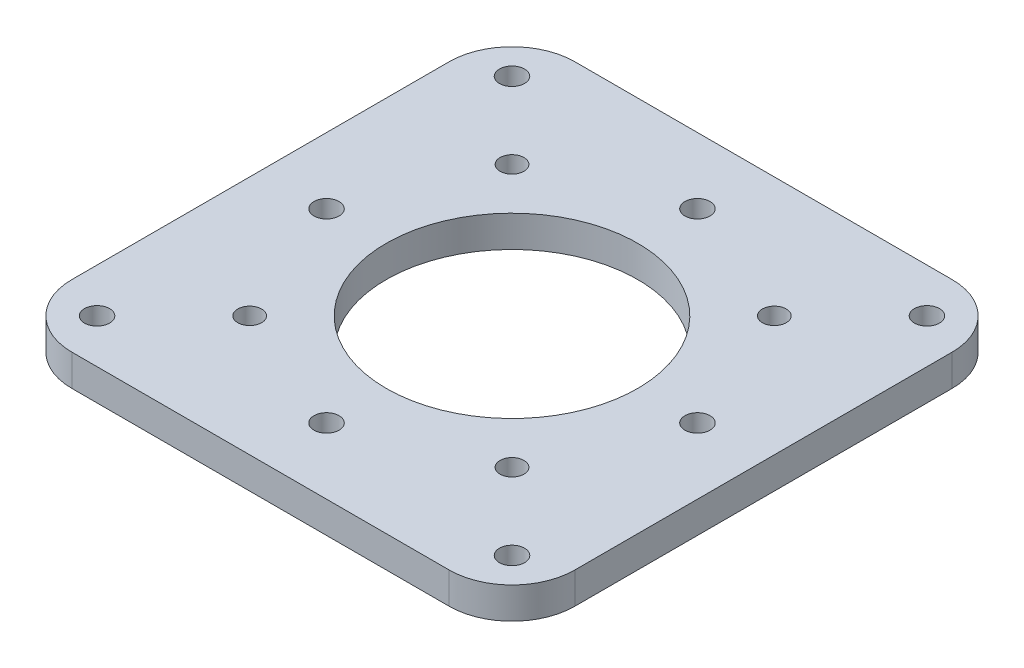
ISO-10303-21;
HEADER;
FILE_DESCRIPTION(('STEP AP214'),'2;1');
FILE_NAME('part.step','',(''),(''),'','','');
FILE_SCHEMA(('AUTOMOTIVE_DESIGN { 1 0 10303 214 1 1 1 1 }'));
ENDSEC;
DATA;
#1=APPLICATION_CONTEXT('core data for automotive mechanical design processes');
#2=APPLICATION_PROTOCOL_DEFINITION('international standard','automotive_design',2000,#1);
#3=PRODUCT_CONTEXT('',#1,'mechanical');
#4=PRODUCT('Part','Part','',(#3));
#5=PRODUCT_RELATED_PRODUCT_CATEGORY('part','',(#4));
#6=PRODUCT_DEFINITION_FORMATION('','',#4);
#7=PRODUCT_DEFINITION_CONTEXT('part definition',#1,'design');
#8=PRODUCT_DEFINITION('design','',#6,#7);
#9=PRODUCT_DEFINITION_SHAPE('','',#8);
#10=(LENGTH_UNIT() NAMED_UNIT(*) SI_UNIT(.MILLI.,.METRE.));
#11=(NAMED_UNIT(*) PLANE_ANGLE_UNIT() SI_UNIT($,.RADIAN.));
#12=(NAMED_UNIT(*) SI_UNIT($,.STERADIAN.) SOLID_ANGLE_UNIT());
#13=UNCERTAINTY_MEASURE_WITH_UNIT(LENGTH_MEASURE(1.E-05),#10,'distance_accuracy_value','');
#14=(GEOMETRIC_REPRESENTATION_CONTEXT(3) GLOBAL_UNCERTAINTY_ASSIGNED_CONTEXT((#13)) GLOBAL_UNIT_ASSIGNED_CONTEXT((#10,
#11,#12)) REPRESENTATION_CONTEXT('',''));
#15=CARTESIAN_POINT('',(0.,0.,0.));
#16=DIRECTION('',(0.,0.,1.));
#17=DIRECTION('',(1.,0.,0.));
#18=AXIS2_PLACEMENT_3D('',#15,#16,#17);
#19=CARTESIAN_POINT('',(0.,5.,0.));
#20=DIRECTION('',(0.,-1.,0.));
#21=DIRECTION('',(0.,0.,-1.));
#22=AXIS2_PLACEMENT_3D('',#19,#20,#21);
#23=PLANE('',#22);
#24=DIRECTION('',(-1.,0.,0.));
#25=VECTOR('',#24,1.);
#26=CARTESIAN_POINT('',(-40.,5.,-40.));
#27=LINE('',#26,#25);
#28=CARTESIAN_POINT('',(30.,5.,-40.));
#29=VERTEX_POINT('',#28);
#30=CARTESIAN_POINT('',(-30.,5.,-40.));
#31=VERTEX_POINT('',#30);
#32=EDGE_CURVE('E171',#29,#31,#27,.T.);
#33=ORIENTED_EDGE('',*,*,#32,.T.);
#34=CARTESIAN_POINT('',(-30.,5.,-30.));
#35=DIRECTION('',(0.,-1.,0.));
#36=DIRECTION('',(0.,0.,-1.));
#37=AXIS2_PLACEMENT_3D('',#34,#35,#36);
#38=CIRCLE('',#37,10.);
#39=CARTESIAN_POINT('',(-40.,5.,-30.));
#40=VERTEX_POINT('',#39);
#41=EDGE_CURVE('E151',#31,#40,#38,.F.);
#42=ORIENTED_EDGE('',*,*,#41,.T.);
#43=DIRECTION('',(0.,0.,1.));
#44=VECTOR('',#43,1.);
#45=CARTESIAN_POINT('',(-40.,5.,40.));
#46=LINE('',#45,#44);
#47=CARTESIAN_POINT('',(-40.,5.,30.));
#48=VERTEX_POINT('',#47);
#49=EDGE_CURVE('E121',#40,#48,#46,.T.);
#50=ORIENTED_EDGE('',*,*,#49,.T.);
#51=CARTESIAN_POINT('',(-30.,5.,30.));
#52=DIRECTION('',(0.,-1.,0.));
#53=DIRECTION('',(0.,0.,-1.));
#54=AXIS2_PLACEMENT_3D('',#51,#52,#53);
#55=CIRCLE('',#54,10.);
#56=CARTESIAN_POINT('',(-30.,5.,40.));
#57=VERTEX_POINT('',#56);
#58=EDGE_CURVE('E57',#48,#57,#55,.F.);
#59=ORIENTED_EDGE('',*,*,#58,.T.);
#60=DIRECTION('',(1.,0.,0.));
#61=VECTOR('',#60,1.);
#62=CARTESIAN_POINT('',(-40.,5.,40.));
#63=LINE('',#62,#61);
#64=CARTESIAN_POINT('',(30.,5.,40.));
#65=VERTEX_POINT('',#64);
#66=EDGE_CURVE('E138',#57,#65,#63,.T.);
#67=ORIENTED_EDGE('',*,*,#66,.T.);
#68=CARTESIAN_POINT('',(30.,5.,30.));
#69=DIRECTION('',(0.,-1.,0.));
#70=DIRECTION('',(0.,0.,-1.));
#71=AXIS2_PLACEMENT_3D('',#68,#69,#70);
#72=CIRCLE('',#71,10.);
#73=CARTESIAN_POINT('',(40.,5.,30.));
#74=VERTEX_POINT('',#73);
#75=EDGE_CURVE('E146',#65,#74,#72,.F.);
#76=ORIENTED_EDGE('',*,*,#75,.T.);
#77=DIRECTION('',(0.,0.,-1.));
#78=VECTOR('',#77,1.);
#79=CARTESIAN_POINT('',(40.,5.,40.));
#80=LINE('',#79,#78);
#81=CARTESIAN_POINT('',(40.,5.,-30.));
#82=VERTEX_POINT('',#81);
#83=EDGE_CURVE('E132',#74,#82,#80,.T.);
#84=ORIENTED_EDGE('',*,*,#83,.T.);
#85=CARTESIAN_POINT('',(30.,5.,-30.));
#86=DIRECTION('',(0.,-1.,0.));
#87=DIRECTION('',(0.,0.,-1.));
#88=AXIS2_PLACEMENT_3D('',#85,#86,#87);
#89=CIRCLE('',#88,10.);
#90=EDGE_CURVE('E149',#82,#29,#89,.F.);
#91=ORIENTED_EDGE('',*,*,#90,.T.);
#92=EDGE_LOOP('',(#33,#42,#50,#59,#67,#76,#84,#91));
#93=FACE_BOUND('',#92,.T.);
#94=CARTESIAN_POINT('',(20.859650045003,5.,-20.8596500450033));
#95=DIRECTION('',(0.,1.,0.));
#96=DIRECTION('',(0.,0.,1.));
#97=AXIS2_PLACEMENT_3D('',#94,#95,#96);
#98=CIRCLE('',#97,1.90000000000001);
#99=CARTESIAN_POINT('',(20.859650045003,5.,-18.9596500450033));
#100=VERTEX_POINT('',#99);
#101=EDGE_CURVE('E177',#100,#100,#98,.T.);
#102=ORIENTED_EDGE('',*,*,#101,.F.);
#103=EDGE_LOOP('',(#102));
#104=FACE_BOUND('',#103,.T.);
#105=CARTESIAN_POINT('',(20.8596500450044,5.,20.859650045003));
#106=DIRECTION('',(0.,1.,0.));
#107=DIRECTION('',(0.,0.,1.));
#108=AXIS2_PLACEMENT_3D('',#105,#106,#107);
#109=CIRCLE('',#108,1.9);
#110=CARTESIAN_POINT('',(20.8596500450044,5.,22.759650045003));
#111=VERTEX_POINT('',#110);
#112=EDGE_CURVE('E186',#111,#111,#109,.T.);
#113=ORIENTED_EDGE('',*,*,#112,.F.);
#114=EDGE_LOOP('',(#113));
#115=FACE_BOUND('',#114,.T.);
#116=CARTESIAN_POINT('',(-20.8596500450019,5.,20.8596500450044));
#117=DIRECTION('',(0.,1.,0.));
#118=DIRECTION('',(0.,0.,1.));
#119=AXIS2_PLACEMENT_3D('',#116,#117,#118);
#120=CIRCLE('',#119,1.9);
#121=CARTESIAN_POINT('',(-20.8596500450019,5.,22.7596500450044));
#122=VERTEX_POINT('',#121);
#123=EDGE_CURVE('E191',#122,#122,#120,.T.);
#124=ORIENTED_EDGE('',*,*,#123,.F.);
#125=EDGE_LOOP('',(#124));
#126=FACE_BOUND('',#125,.T.);
#127=CARTESIAN_POINT('',(-20.8596500450033,5.,-20.8596500450019));
#128=DIRECTION('',(0.,1.,0.));
#129=DIRECTION('',(0.,0.,1.));
#130=AXIS2_PLACEMENT_3D('',#127,#128,#129);
#131=CIRCLE('',#130,1.9);
#132=CARTESIAN_POINT('',(-20.8596500450033,5.,-18.9596500450019));
#133=VERTEX_POINT('',#132);
#134=EDGE_CURVE('E197',#133,#133,#131,.T.);
#135=ORIENTED_EDGE('',*,*,#134,.F.);
#136=EDGE_LOOP('',(#135));
#137=FACE_BOUND('',#136,.T.);
#138=CARTESIAN_POINT('',(-33.,5.,-33.));
#139=DIRECTION('',(0.,1.,0.));
#140=DIRECTION('',(0.,0.,1.));
#141=AXIS2_PLACEMENT_3D('',#138,#139,#140);
#142=CIRCLE('',#141,2.);
#143=CARTESIAN_POINT('',(-33.,5.,-31.));
#144=VERTEX_POINT('',#143);
#145=EDGE_CURVE('E203',#144,#144,#142,.T.);
#146=ORIENTED_EDGE('',*,*,#145,.F.);
#147=EDGE_LOOP('',(#146));
#148=FACE_BOUND('',#147,.T.);
#149=CARTESIAN_POINT('',(33.,5.,-33.));
#150=DIRECTION('',(0.,1.,0.));
#151=DIRECTION('',(0.,0.,1.));
#152=AXIS2_PLACEMENT_3D('',#149,#150,#151);
#153=CIRCLE('',#152,2.);
#154=CARTESIAN_POINT('',(33.,5.,-31.));
#155=VERTEX_POINT('',#154);
#156=EDGE_CURVE('E209',#155,#155,#153,.T.);
#157=ORIENTED_EDGE('',*,*,#156,.F.);
#158=EDGE_LOOP('',(#157));
#159=FACE_BOUND('',#158,.T.);
#160=CARTESIAN_POINT('',(33.,5.,33.));
#161=DIRECTION('',(0.,1.,0.));
#162=DIRECTION('',(0.,0.,1.));
#163=AXIS2_PLACEMENT_3D('',#160,#161,#162);
#164=CIRCLE('',#163,2.);
#165=CARTESIAN_POINT('',(33.,5.,35.));
#166=VERTEX_POINT('',#165);
#167=EDGE_CURVE('E215',#166,#166,#164,.T.);
#168=ORIENTED_EDGE('',*,*,#167,.F.);
#169=EDGE_LOOP('',(#168));
#170=FACE_BOUND('',#169,.T.);
#171=CARTESIAN_POINT('',(-33.,5.,33.));
#172=DIRECTION('',(0.,1.,0.));
#173=DIRECTION('',(0.,0.,1.));
#174=AXIS2_PLACEMENT_3D('',#171,#172,#173);
#175=CIRCLE('',#174,2.);
#176=CARTESIAN_POINT('',(-33.,5.,35.));
#177=VERTEX_POINT('',#176);
#178=EDGE_CURVE('E221',#177,#177,#175,.T.);
#179=ORIENTED_EDGE('',*,*,#178,.F.);
#180=EDGE_LOOP('',(#179));
#181=FACE_BOUND('',#180,.T.);
#182=CARTESIAN_POINT('',(0.,5.,0.));
#183=DIRECTION('',(0.,1.,0.));
#184=DIRECTION('',(0.,0.,1.));
#185=AXIS2_PLACEMENT_3D('',#182,#183,#184);
#186=CIRCLE('',#185,20.);
#187=CARTESIAN_POINT('',(0.,5.,20.));
#188=VERTEX_POINT('',#187);
#189=EDGE_CURVE('E227',#188,#188,#186,.T.);
#190=ORIENTED_EDGE('',*,*,#189,.F.);
#191=EDGE_LOOP('',(#190));
#192=FACE_BOUND('',#191,.T.);
#193=CARTESIAN_POINT('',(0.,5.,-29.5));
#194=DIRECTION('',(0.,1.,0.));
#195=DIRECTION('',(0.,0.,1.));
#196=AXIS2_PLACEMENT_3D('',#193,#194,#195);
#197=CIRCLE('',#196,2.);
#198=CARTESIAN_POINT('',(0.,5.,-27.5));
#199=VERTEX_POINT('',#198);
#200=EDGE_CURVE('E233',#199,#199,#197,.T.);
#201=ORIENTED_EDGE('',*,*,#200,.F.);
#202=EDGE_LOOP('',(#201));
#203=FACE_BOUND('',#202,.T.);
#204=CARTESIAN_POINT('',(29.5000000000008,5.,-8.38674380875494E-13));
#205=DIRECTION('',(0.,1.,0.));
#206=DIRECTION('',(0.,0.,1.));
#207=AXIS2_PLACEMENT_3D('',#204,#205,#206);
#208=CIRCLE('',#207,2.00000000000067);
#209=CARTESIAN_POINT('',(29.5000000000008,5.,1.99999999999983));
#210=VERTEX_POINT('',#209);
#211=EDGE_CURVE('E239',#210,#210,#208,.T.);
#212=ORIENTED_EDGE('',*,*,#211,.F.);
#213=EDGE_LOOP('',(#212));
#214=FACE_BOUND('',#213,.T.);
#215=CARTESIAN_POINT('',(1.67863464089009E-12,5.,29.5));
#216=DIRECTION('',(0.,1.,0.));
#217=DIRECTION('',(0.,0.,1.));
#218=AXIS2_PLACEMENT_3D('',#215,#216,#217);
#219=CIRCLE('',#218,2.00000000000181);
#220=CARTESIAN_POINT('',(1.67863464089009E-12,5.,31.5000000000018));
#221=VERTEX_POINT('',#220);
#222=EDGE_CURVE('E245',#221,#221,#219,.T.);
#223=ORIENTED_EDGE('',*,*,#222,.F.);
#224=EDGE_LOOP('',(#223));
#225=FACE_BOUND('',#224,.T.);
#226=CARTESIAN_POINT('',(-29.4999999999992,5.,8.42287088932979E-13));
#227=DIRECTION('',(0.,1.,0.));
#228=DIRECTION('',(0.,0.,1.));
#229=AXIS2_PLACEMENT_3D('',#226,#227,#228);
#230=CIRCLE('',#229,2.00000000000136);
#231=CARTESIAN_POINT('',(-29.4999999999992,5.,2.0000000000022));
#232=VERTEX_POINT('',#231);
#233=EDGE_CURVE('E251',#232,#232,#230,.T.);
#234=ORIENTED_EDGE('',*,*,#233,.F.);
#235=EDGE_LOOP('',(#234));
#236=FACE_BOUND('',#235,.T.);
#237=ADVANCED_FACE('F36',(#93,#104,#115,#126,#137,#148,#159,#170,#181,#192,#203,#214,#225,#236),
#23,.F.);
#238=CARTESIAN_POINT('',(0.,0.,0.));
#239=DIRECTION('',(0.,-1.,0.));
#240=DIRECTION('',(0.,0.,-1.));
#241=AXIS2_PLACEMENT_3D('',#238,#239,#240);
#242=PLANE('',#241);
#243=CARTESIAN_POINT('',(1.67863464089009E-12,0.,29.5));
#244=DIRECTION('',(0.,1.,0.));
#245=DIRECTION('',(0.,0.,1.));
#246=AXIS2_PLACEMENT_3D('',#243,#244,#245);
#247=CIRCLE('',#246,2.00000000000181);
#248=CARTESIAN_POINT('',(1.67863464089009E-12,0.,31.5000000000018));
#249=VERTEX_POINT('',#248);
#250=EDGE_CURVE('E248',#249,#249,#247,.T.);
#251=ORIENTED_EDGE('',*,*,#250,.T.);
#252=EDGE_LOOP('',(#251));
#253=FACE_BOUND('',#252,.T.);
#254=CARTESIAN_POINT('',(0.,0.,-29.5));
#255=DIRECTION('',(0.,1.,0.));
#256=DIRECTION('',(0.,0.,1.));
#257=AXIS2_PLACEMENT_3D('',#254,#255,#256);
#258=CIRCLE('',#257,2.);
#259=CARTESIAN_POINT('',(0.,0.,-27.5));
#260=VERTEX_POINT('',#259);
#261=EDGE_CURVE('E236',#260,#260,#258,.T.);
#262=ORIENTED_EDGE('',*,*,#261,.T.);
#263=EDGE_LOOP('',(#262));
#264=FACE_BOUND('',#263,.T.);
#265=CARTESIAN_POINT('',(-33.,0.,33.));
#266=DIRECTION('',(0.,1.,0.));
#267=DIRECTION('',(0.,0.,1.));
#268=AXIS2_PLACEMENT_3D('',#265,#266,#267);
#269=CIRCLE('',#268,2.);
#270=CARTESIAN_POINT('',(-33.,0.,35.));
#271=VERTEX_POINT('',#270);
#272=EDGE_CURVE('E224',#271,#271,#269,.T.);
#273=ORIENTED_EDGE('',*,*,#272,.T.);
#274=EDGE_LOOP('',(#273));
#275=FACE_BOUND('',#274,.T.);
#276=CARTESIAN_POINT('',(33.,0.,-33.));
#277=DIRECTION('',(0.,1.,0.));
#278=DIRECTION('',(0.,0.,1.));
#279=AXIS2_PLACEMENT_3D('',#276,#277,#278);
#280=CIRCLE('',#279,2.);
#281=CARTESIAN_POINT('',(33.,0.,-31.));
#282=VERTEX_POINT('',#281);
#283=EDGE_CURVE('E212',#282,#282,#280,.T.);
#284=ORIENTED_EDGE('',*,*,#283,.T.);
#285=EDGE_LOOP('',(#284));
#286=FACE_BOUND('',#285,.T.);
#287=CARTESIAN_POINT('',(-20.8596500450033,0.,-20.8596500450019));
#288=DIRECTION('',(0.,1.,0.));
#289=DIRECTION('',(0.,0.,1.));
#290=AXIS2_PLACEMENT_3D('',#287,#288,#289);
#291=CIRCLE('',#290,1.9);
#292=CARTESIAN_POINT('',(-20.8596500450033,0.,-18.9596500450019));
#293=VERTEX_POINT('',#292);
#294=EDGE_CURVE('E200',#293,#293,#291,.T.);
#295=ORIENTED_EDGE('',*,*,#294,.T.);
#296=EDGE_LOOP('',(#295));
#297=FACE_BOUND('',#296,.T.);
#298=CARTESIAN_POINT('',(20.8596500450044,0.,20.859650045003));
#299=DIRECTION('',(0.,1.,0.));
#300=DIRECTION('',(0.,0.,1.));
#301=AXIS2_PLACEMENT_3D('',#298,#299,#300);
#302=CIRCLE('',#301,1.9);
#303=CARTESIAN_POINT('',(20.8596500450044,0.,22.759650045003));
#304=VERTEX_POINT('',#303);
#305=EDGE_CURVE('E188',#304,#304,#302,.T.);
#306=ORIENTED_EDGE('',*,*,#305,.T.);
#307=EDGE_LOOP('',(#306));
#308=FACE_BOUND('',#307,.T.);
#309=DIRECTION('',(0.,0.,1.));
#310=VECTOR('',#309,1.);
#311=CARTESIAN_POINT('',(-40.,0.,40.));
#312=LINE('',#311,#310);
#313=CARTESIAN_POINT('',(-40.,0.,-30.));
#314=VERTEX_POINT('',#313);
#315=CARTESIAN_POINT('',(-40.,0.,30.));
#316=VERTEX_POINT('',#315);
#317=EDGE_CURVE('E119',#314,#316,#312,.T.);
#318=ORIENTED_EDGE('',*,*,#317,.F.);
#319=CARTESIAN_POINT('',(-30.,0.,-30.));
#320=DIRECTION('',(0.,-1.,0.));
#321=DIRECTION('',(0.,0.,-1.));
#322=AXIS2_PLACEMENT_3D('',#319,#320,#321);
#323=CIRCLE('',#322,10.);
#324=CARTESIAN_POINT('',(-30.,0.,-40.));
#325=VERTEX_POINT('',#324);
#326=EDGE_CURVE('E102',#314,#325,#323,.T.);
#327=ORIENTED_EDGE('',*,*,#326,.T.);
#328=DIRECTION('',(-1.,0.,0.));
#329=VECTOR('',#328,1.);
#330=CARTESIAN_POINT('',(-40.,0.,-40.));
#331=LINE('',#330,#329);
#332=CARTESIAN_POINT('',(30.,0.,-40.));
#333=VERTEX_POINT('',#332);
#334=EDGE_CURVE('E130',#333,#325,#331,.T.);
#335=ORIENTED_EDGE('',*,*,#334,.F.);
#336=CARTESIAN_POINT('',(30.,0.,-30.));
#337=DIRECTION('',(0.,-1.,0.));
#338=DIRECTION('',(0.,0.,-1.));
#339=AXIS2_PLACEMENT_3D('',#336,#337,#338);
#340=CIRCLE('',#339,10.);
#341=CARTESIAN_POINT('',(40.,0.,-30.));
#342=VERTEX_POINT('',#341);
#343=EDGE_CURVE('E113',#333,#342,#340,.T.);
#344=ORIENTED_EDGE('',*,*,#343,.T.);
#345=DIRECTION('',(0.,0.,-1.));
#346=VECTOR('',#345,1.);
#347=CARTESIAN_POINT('',(40.,0.,40.));
#348=LINE('',#347,#346);
#349=CARTESIAN_POINT('',(40.,0.,30.));
#350=VERTEX_POINT('',#349);
#351=EDGE_CURVE('E134',#350,#342,#348,.T.);
#352=ORIENTED_EDGE('',*,*,#351,.F.);
#353=CARTESIAN_POINT('',(30.,0.,30.));
#354=DIRECTION('',(0.,-1.,0.));
#355=DIRECTION('',(0.,0.,-1.));
#356=AXIS2_PLACEMENT_3D('',#353,#354,#355);
#357=CIRCLE('',#356,10.);
#358=CARTESIAN_POINT('',(30.,0.,40.));
#359=VERTEX_POINT('',#358);
#360=EDGE_CURVE('E122',#350,#359,#357,.T.);
#361=ORIENTED_EDGE('',*,*,#360,.T.);
#362=DIRECTION('',(1.,0.,0.));
#363=VECTOR('',#362,1.);
#364=CARTESIAN_POINT('',(-40.,0.,40.));
#365=LINE('',#364,#363);
#366=CARTESIAN_POINT('',(-30.,0.,40.));
#367=VERTEX_POINT('',#366);
#368=EDGE_CURVE('E129',#367,#359,#365,.T.);
#369=ORIENTED_EDGE('',*,*,#368,.F.);
#370=CARTESIAN_POINT('',(-30.,0.,30.));
#371=DIRECTION('',(0.,-1.,0.));
#372=DIRECTION('',(0.,0.,-1.));
#373=AXIS2_PLACEMENT_3D('',#370,#371,#372);
#374=CIRCLE('',#373,10.);
#375=EDGE_CURVE('E128',#367,#316,#374,.T.);
#376=ORIENTED_EDGE('',*,*,#375,.T.);
#377=EDGE_LOOP('',(#318,#327,#335,#344,#352,#361,#369,#376));
#378=FACE_BOUND('',#377,.T.);
#379=CARTESIAN_POINT('',(20.859650045003,0.,-20.8596500450033));
#380=DIRECTION('',(0.,1.,0.));
#381=DIRECTION('',(0.,0.,1.));
#382=AXIS2_PLACEMENT_3D('',#379,#380,#381);
#383=CIRCLE('',#382,1.90000000000001);
#384=CARTESIAN_POINT('',(20.859650045003,0.,-18.9596500450033));
#385=VERTEX_POINT('',#384);
#386=EDGE_CURVE('E179',#385,#385,#383,.T.);
#387=ORIENTED_EDGE('',*,*,#386,.T.);
#388=EDGE_LOOP('',(#387));
#389=FACE_BOUND('',#388,.T.);
#390=CARTESIAN_POINT('',(-20.8596500450019,0.,20.8596500450044));
#391=DIRECTION('',(0.,1.,0.));
#392=DIRECTION('',(0.,0.,1.));
#393=AXIS2_PLACEMENT_3D('',#390,#391,#392);
#394=CIRCLE('',#393,1.9);
#395=CARTESIAN_POINT('',(-20.8596500450019,0.,22.7596500450044));
#396=VERTEX_POINT('',#395);
#397=EDGE_CURVE('E194',#396,#396,#394,.T.);
#398=ORIENTED_EDGE('',*,*,#397,.T.);
#399=EDGE_LOOP('',(#398));
#400=FACE_BOUND('',#399,.T.);
#401=CARTESIAN_POINT('',(-33.,0.,-33.));
#402=DIRECTION('',(0.,1.,0.));
#403=DIRECTION('',(0.,0.,1.));
#404=AXIS2_PLACEMENT_3D('',#401,#402,#403);
#405=CIRCLE('',#404,2.);
#406=CARTESIAN_POINT('',(-33.,0.,-31.));
#407=VERTEX_POINT('',#406);
#408=EDGE_CURVE('E206',#407,#407,#405,.T.);
#409=ORIENTED_EDGE('',*,*,#408,.T.);
#410=EDGE_LOOP('',(#409));
#411=FACE_BOUND('',#410,.T.);
#412=CARTESIAN_POINT('',(33.,0.,33.));
#413=DIRECTION('',(0.,1.,0.));
#414=DIRECTION('',(0.,0.,1.));
#415=AXIS2_PLACEMENT_3D('',#412,#413,#414);
#416=CIRCLE('',#415,2.);
#417=CARTESIAN_POINT('',(33.,0.,35.));
#418=VERTEX_POINT('',#417);
#419=EDGE_CURVE('E218',#418,#418,#416,.T.);
#420=ORIENTED_EDGE('',*,*,#419,.T.);
#421=EDGE_LOOP('',(#420));
#422=FACE_BOUND('',#421,.T.);
#423=CARTESIAN_POINT('',(0.,0.,0.));
#424=DIRECTION('',(0.,1.,0.));
#425=DIRECTION('',(0.,0.,1.));
#426=AXIS2_PLACEMENT_3D('',#423,#424,#425);
#427=CIRCLE('',#426,20.);
#428=CARTESIAN_POINT('',(0.,0.,20.));
#429=VERTEX_POINT('',#428);
#430=EDGE_CURVE('E230',#429,#429,#427,.T.);
#431=ORIENTED_EDGE('',*,*,#430,.T.);
#432=EDGE_LOOP('',(#431));
#433=FACE_BOUND('',#432,.T.);
#434=CARTESIAN_POINT('',(29.5000000000008,0.,-8.38674380875494E-13));
#435=DIRECTION('',(0.,1.,0.));
#436=DIRECTION('',(0.,0.,1.));
#437=AXIS2_PLACEMENT_3D('',#434,#435,#436);
#438=CIRCLE('',#437,2.00000000000067);
#439=CARTESIAN_POINT('',(29.5000000000008,0.,1.99999999999983));
#440=VERTEX_POINT('',#439);
#441=EDGE_CURVE('E242',#440,#440,#438,.T.);
#442=ORIENTED_EDGE('',*,*,#441,.T.);
#443=EDGE_LOOP('',(#442));
#444=FACE_BOUND('',#443,.T.);
#445=CARTESIAN_POINT('',(-29.4999999999992,0.,8.42287088932979E-13));
#446=DIRECTION('',(0.,1.,0.));
#447=DIRECTION('',(0.,0.,1.));
#448=AXIS2_PLACEMENT_3D('',#445,#446,#447);
#449=CIRCLE('',#448,2.00000000000136);
#450=CARTESIAN_POINT('',(-29.4999999999992,0.,2.0000000000022));
#451=VERTEX_POINT('',#450);
#452=EDGE_CURVE('E254',#451,#451,#449,.T.);
#453=ORIENTED_EDGE('',*,*,#452,.T.);
#454=EDGE_LOOP('',(#453));
#455=FACE_BOUND('',#454,.T.);
#456=ADVANCED_FACE('F125',(#253,#264,#275,#286,#297,#308,#378,#389,#400,#411,#422,#433,#444,
#455),#242,.T.);
#457=CARTESIAN_POINT('',(40.,5.,40.));
#458=DIRECTION('',(-1.,0.,0.));
#459=DIRECTION('',(0.,0.,1.));
#460=AXIS2_PLACEMENT_3D('',#457,#458,#459);
#461=PLANE('',#460);
#462=ORIENTED_EDGE('',*,*,#351,.T.);
#463=DIRECTION('',(0.,-1.,0.));
#464=VECTOR('',#463,1.);
#465=CARTESIAN_POINT('',(40.,5.,-30.));
#466=LINE('',#465,#464);
#467=EDGE_CURVE('E156',#342,#82,#466,.F.);
#468=ORIENTED_EDGE('',*,*,#467,.T.);
#469=ORIENTED_EDGE('',*,*,#83,.F.);
#470=DIRECTION('',(0.,-1.,0.));
#471=VECTOR('',#470,1.);
#472=CARTESIAN_POINT('',(40.,5.,30.));
#473=LINE('',#472,#471);
#474=EDGE_CURVE('E153',#74,#350,#473,.T.);
#475=ORIENTED_EDGE('',*,*,#474,.T.);
#476=EDGE_LOOP('',(#462,#468,#469,#475));
#477=FACE_BOUND('',#476,.T.);
#478=ADVANCED_FACE('F162',(#477),#461,.F.);
#479=CARTESIAN_POINT('',(-40.,5.,-40.));
#480=DIRECTION('',(0.,0.,1.));
#481=DIRECTION('',(1.,0.,0.));
#482=AXIS2_PLACEMENT_3D('',#479,#480,#481);
#483=PLANE('',#482);
#484=ORIENTED_EDGE('',*,*,#334,.T.);
#485=DIRECTION('',(0.,-1.,0.));
#486=VECTOR('',#485,1.);
#487=CARTESIAN_POINT('',(-30.,5.,-40.));
#488=LINE('',#487,#486);
#489=EDGE_CURVE('E107',#325,#31,#488,.F.);
#490=ORIENTED_EDGE('',*,*,#489,.T.);
#491=ORIENTED_EDGE('',*,*,#32,.F.);
#492=DIRECTION('',(0.,-1.,0.));
#493=VECTOR('',#492,1.);
#494=CARTESIAN_POINT('',(30.,5.,-40.));
#495=LINE('',#494,#493);
#496=EDGE_CURVE('E112',#29,#333,#495,.T.);
#497=ORIENTED_EDGE('',*,*,#496,.T.);
#498=EDGE_LOOP('',(#484,#490,#491,#497));
#499=FACE_BOUND('',#498,.T.);
#500=ADVANCED_FACE('F176',(#499),#483,.F.);
#501=CARTESIAN_POINT('',(-40.,5.,40.));
#502=DIRECTION('',(1.,0.,0.));
#503=DIRECTION('',(0.,0.,-1.));
#504=AXIS2_PLACEMENT_3D('',#501,#502,#503);
#505=PLANE('',#504);
#506=ORIENTED_EDGE('',*,*,#49,.F.);
#507=DIRECTION('',(0.,-1.,0.));
#508=VECTOR('',#507,1.);
#509=CARTESIAN_POINT('',(-40.,5.,-30.));
#510=LINE('',#509,#508);
#511=EDGE_CURVE('E106',#40,#314,#510,.T.);
#512=ORIENTED_EDGE('',*,*,#511,.T.);
#513=ORIENTED_EDGE('',*,*,#317,.T.);
#514=DIRECTION('',(0.,-1.,0.));
#515=VECTOR('',#514,1.);
#516=CARTESIAN_POINT('',(-40.,5.,30.));
#517=LINE('',#516,#515);
#518=EDGE_CURVE('E123',#316,#48,#517,.F.);
#519=ORIENTED_EDGE('',*,*,#518,.T.);
#520=EDGE_LOOP('',(#506,#512,#513,#519));
#521=FACE_BOUND('',#520,.T.);
#522=ADVANCED_FACE('F118',(#521),#505,.F.);
#523=CARTESIAN_POINT('',(-40.,5.,40.));
#524=DIRECTION('',(0.,0.,-1.));
#525=DIRECTION('',(-1.,0.,0.));
#526=AXIS2_PLACEMENT_3D('',#523,#524,#525);
#527=PLANE('',#526);
#528=ORIENTED_EDGE('',*,*,#66,.F.);
#529=DIRECTION('',(0.,-1.,0.));
#530=VECTOR('',#529,1.);
#531=CARTESIAN_POINT('',(-30.,5.,40.));
#532=LINE('',#531,#530);
#533=EDGE_CURVE('E11',#57,#367,#532,.T.);
#534=ORIENTED_EDGE('',*,*,#533,.T.);
#535=ORIENTED_EDGE('',*,*,#368,.T.);
#536=DIRECTION('',(0.,-1.,0.));
#537=VECTOR('',#536,1.);
#538=CARTESIAN_POINT('',(30.,5.,40.));
#539=LINE('',#538,#537);
#540=EDGE_CURVE('E44',#359,#65,#539,.F.);
#541=ORIENTED_EDGE('',*,*,#540,.T.);
#542=EDGE_LOOP('',(#528,#534,#535,#541));
#543=FACE_BOUND('',#542,.T.);
#544=ADVANCED_FACE('F274',(#543),#527,.F.);
#545=CARTESIAN_POINT('',(20.859650045003,5.,-20.8596500450033));
#546=DIRECTION('',(0.,-1.,0.));
#547=DIRECTION('',(0.,0.,-1.));
#548=AXIS2_PLACEMENT_3D('',#545,#546,#547);
#549=CYLINDRICAL_SURFACE('',#548,1.90000000000001);
#550=ORIENTED_EDGE('',*,*,#101,.T.);
#551=EDGE_LOOP('',(#550));
#552=FACE_BOUND('',#551,.T.);
#553=ORIENTED_EDGE('',*,*,#386,.F.);
#554=EDGE_LOOP('',(#553));
#555=FACE_BOUND('',#554,.T.);
#556=ADVANCED_FACE('F271',(#552,#555),#549,.F.);
#557=CARTESIAN_POINT('',(20.8596500450044,5.,20.859650045003));
#558=DIRECTION('',(0.,-1.,0.));
#559=DIRECTION('',(0.,0.,-1.));
#560=AXIS2_PLACEMENT_3D('',#557,#558,#559);
#561=CYLINDRICAL_SURFACE('',#560,1.9);
#562=ORIENTED_EDGE('',*,*,#112,.T.);
#563=EDGE_LOOP('',(#562));
#564=FACE_BOUND('',#563,.T.);
#565=ORIENTED_EDGE('',*,*,#305,.F.);
#566=EDGE_LOOP('',(#565));
#567=FACE_BOUND('',#566,.T.);
#568=ADVANCED_FACE('F456',(#564,#567),#561,.F.);
#569=CARTESIAN_POINT('',(-20.8596500450019,5.,20.8596500450044));
#570=DIRECTION('',(0.,-1.,0.));
#571=DIRECTION('',(0.,0.,-1.));
#572=AXIS2_PLACEMENT_3D('',#569,#570,#571);
#573=CYLINDRICAL_SURFACE('',#572,1.9);
#574=ORIENTED_EDGE('',*,*,#123,.T.);
#575=EDGE_LOOP('',(#574));
#576=FACE_BOUND('',#575,.T.);
#577=ORIENTED_EDGE('',*,*,#397,.F.);
#578=EDGE_LOOP('',(#577));
#579=FACE_BOUND('',#578,.T.);
#580=ADVANCED_FACE('F446',(#576,#579),#573,.F.);
#581=CARTESIAN_POINT('',(-20.8596500450033,5.,-20.8596500450019));
#582=DIRECTION('',(0.,-1.,0.));
#583=DIRECTION('',(0.,0.,-1.));
#584=AXIS2_PLACEMENT_3D('',#581,#582,#583);
#585=CYLINDRICAL_SURFACE('',#584,1.9);
#586=ORIENTED_EDGE('',*,*,#134,.T.);
#587=EDGE_LOOP('',(#586));
#588=FACE_BOUND('',#587,.T.);
#589=ORIENTED_EDGE('',*,*,#294,.F.);
#590=EDGE_LOOP('',(#589));
#591=FACE_BOUND('',#590,.T.);
#592=ADVANCED_FACE('F436',(#588,#591),#585,.F.);
#593=CARTESIAN_POINT('',(-33.,5.,-33.));
#594=DIRECTION('',(0.,-1.,0.));
#595=DIRECTION('',(0.,0.,-1.));
#596=AXIS2_PLACEMENT_3D('',#593,#594,#595);
#597=CYLINDRICAL_SURFACE('',#596,2.);
#598=ORIENTED_EDGE('',*,*,#145,.T.);
#599=EDGE_LOOP('',(#598));
#600=FACE_BOUND('',#599,.T.);
#601=ORIENTED_EDGE('',*,*,#408,.F.);
#602=EDGE_LOOP('',(#601));
#603=FACE_BOUND('',#602,.T.);
#604=ADVANCED_FACE('F426',(#600,#603),#597,.F.);
#605=CARTESIAN_POINT('',(33.,5.,-33.));
#606=DIRECTION('',(0.,-1.,0.));
#607=DIRECTION('',(0.,0.,-1.));
#608=AXIS2_PLACEMENT_3D('',#605,#606,#607);
#609=CYLINDRICAL_SURFACE('',#608,2.);
#610=ORIENTED_EDGE('',*,*,#156,.T.);
#611=EDGE_LOOP('',(#610));
#612=FACE_BOUND('',#611,.T.);
#613=ORIENTED_EDGE('',*,*,#283,.F.);
#614=EDGE_LOOP('',(#613));
#615=FACE_BOUND('',#614,.T.);
#616=ADVANCED_FACE('F416',(#612,#615),#609,.F.);
#617=CARTESIAN_POINT('',(33.,5.,33.));
#618=DIRECTION('',(0.,-1.,0.));
#619=DIRECTION('',(0.,0.,-1.));
#620=AXIS2_PLACEMENT_3D('',#617,#618,#619);
#621=CYLINDRICAL_SURFACE('',#620,2.);
#622=ORIENTED_EDGE('',*,*,#167,.T.);
#623=EDGE_LOOP('',(#622));
#624=FACE_BOUND('',#623,.T.);
#625=ORIENTED_EDGE('',*,*,#419,.F.);
#626=EDGE_LOOP('',(#625));
#627=FACE_BOUND('',#626,.T.);
#628=ADVANCED_FACE('F406',(#624,#627),#621,.F.);
#629=CARTESIAN_POINT('',(-33.,5.,33.));
#630=DIRECTION('',(0.,-1.,0.));
#631=DIRECTION('',(0.,0.,-1.));
#632=AXIS2_PLACEMENT_3D('',#629,#630,#631);
#633=CYLINDRICAL_SURFACE('',#632,2.);
#634=ORIENTED_EDGE('',*,*,#178,.T.);
#635=EDGE_LOOP('',(#634));
#636=FACE_BOUND('',#635,.T.);
#637=ORIENTED_EDGE('',*,*,#272,.F.);
#638=EDGE_LOOP('',(#637));
#639=FACE_BOUND('',#638,.T.);
#640=ADVANCED_FACE('F396',(#636,#639),#633,.F.);
#641=CARTESIAN_POINT('',(0.,5.,0.));
#642=DIRECTION('',(0.,-1.,0.));
#643=DIRECTION('',(0.,0.,-1.));
#644=AXIS2_PLACEMENT_3D('',#641,#642,#643);
#645=CYLINDRICAL_SURFACE('',#644,20.);
#646=ORIENTED_EDGE('',*,*,#189,.T.);
#647=EDGE_LOOP('',(#646));
#648=FACE_BOUND('',#647,.T.);
#649=ORIENTED_EDGE('',*,*,#430,.F.);
#650=EDGE_LOOP('',(#649));
#651=FACE_BOUND('',#650,.T.);
#652=ADVANCED_FACE('F386',(#648,#651),#645,.F.);
#653=CARTESIAN_POINT('',(0.,5.,-29.5));
#654=DIRECTION('',(0.,-1.,0.));
#655=DIRECTION('',(0.,0.,-1.));
#656=AXIS2_PLACEMENT_3D('',#653,#654,#655);
#657=CYLINDRICAL_SURFACE('',#656,2.);
#658=ORIENTED_EDGE('',*,*,#200,.T.);
#659=EDGE_LOOP('',(#658));
#660=FACE_BOUND('',#659,.T.);
#661=ORIENTED_EDGE('',*,*,#261,.F.);
#662=EDGE_LOOP('',(#661));
#663=FACE_BOUND('',#662,.T.);
#664=ADVANCED_FACE('F376',(#660,#663),#657,.F.);
#665=CARTESIAN_POINT('',(29.5000000000008,5.,-8.38674380875494E-13));
#666=DIRECTION('',(0.,-1.,0.));
#667=DIRECTION('',(0.,0.,-1.));
#668=AXIS2_PLACEMENT_3D('',#665,#666,#667);
#669=CYLINDRICAL_SURFACE('',#668,2.00000000000067);
#670=ORIENTED_EDGE('',*,*,#211,.T.);
#671=EDGE_LOOP('',(#670));
#672=FACE_BOUND('',#671,.T.);
#673=ORIENTED_EDGE('',*,*,#441,.F.);
#674=EDGE_LOOP('',(#673));
#675=FACE_BOUND('',#674,.T.);
#676=ADVANCED_FACE('F366',(#672,#675),#669,.F.);
#677=CARTESIAN_POINT('',(1.67863464089009E-12,5.,29.5));
#678=DIRECTION('',(0.,-1.,0.));
#679=DIRECTION('',(0.,0.,-1.));
#680=AXIS2_PLACEMENT_3D('',#677,#678,#679);
#681=CYLINDRICAL_SURFACE('',#680,2.00000000000181);
#682=ORIENTED_EDGE('',*,*,#222,.T.);
#683=EDGE_LOOP('',(#682));
#684=FACE_BOUND('',#683,.T.);
#685=ORIENTED_EDGE('',*,*,#250,.F.);
#686=EDGE_LOOP('',(#685));
#687=FACE_BOUND('',#686,.T.);
#688=ADVANCED_FACE('F357',(#684,#687),#681,.F.);
#689=CARTESIAN_POINT('',(-29.4999999999992,5.,8.42287088932979E-13));
#690=DIRECTION('',(0.,-1.,0.));
#691=DIRECTION('',(0.,0.,-1.));
#692=AXIS2_PLACEMENT_3D('',#689,#690,#691);
#693=CYLINDRICAL_SURFACE('',#692,2.00000000000136);
#694=ORIENTED_EDGE('',*,*,#233,.T.);
#695=EDGE_LOOP('',(#694));
#696=FACE_BOUND('',#695,.T.);
#697=ORIENTED_EDGE('',*,*,#452,.F.);
#698=EDGE_LOOP('',(#697));
#699=FACE_BOUND('',#698,.T.);
#700=ADVANCED_FACE('F260',(#696,#699),#693,.F.);
#701=CARTESIAN_POINT('',(-30.,5.,-30.));
#702=DIRECTION('',(0.,-1.,0.));
#703=DIRECTION('',(0.,0.,-1.));
#704=AXIS2_PLACEMENT_3D('',#701,#702,#703);
#705=CYLINDRICAL_SURFACE('',#704,10.);
#706=ORIENTED_EDGE('',*,*,#41,.F.);
#707=ORIENTED_EDGE('',*,*,#489,.F.);
#708=ORIENTED_EDGE('',*,*,#326,.F.);
#709=ORIENTED_EDGE('',*,*,#511,.F.);
#710=EDGE_LOOP('',(#706,#707,#708,#709));
#711=FACE_BOUND('',#710,.T.);
#712=ADVANCED_FACE('F105',(#711),#705,.T.);
#713=CARTESIAN_POINT('',(30.,5.,-30.));
#714=DIRECTION('',(0.,-1.,0.));
#715=DIRECTION('',(0.,0.,-1.));
#716=AXIS2_PLACEMENT_3D('',#713,#714,#715);
#717=CYLINDRICAL_SURFACE('',#716,10.);
#718=ORIENTED_EDGE('',*,*,#90,.F.);
#719=ORIENTED_EDGE('',*,*,#467,.F.);
#720=ORIENTED_EDGE('',*,*,#343,.F.);
#721=ORIENTED_EDGE('',*,*,#496,.F.);
#722=EDGE_LOOP('',(#718,#719,#720,#721));
#723=FACE_BOUND('',#722,.T.);
#724=ADVANCED_FACE('F174',(#723),#717,.T.);
#725=CARTESIAN_POINT('',(-30.,5.,30.));
#726=DIRECTION('',(0.,-1.,0.));
#727=DIRECTION('',(0.,0.,-1.));
#728=AXIS2_PLACEMENT_3D('',#725,#726,#727);
#729=CYLINDRICAL_SURFACE('',#728,10.);
#730=ORIENTED_EDGE('',*,*,#58,.F.);
#731=ORIENTED_EDGE('',*,*,#518,.F.);
#732=ORIENTED_EDGE('',*,*,#375,.F.);
#733=ORIENTED_EDGE('',*,*,#533,.F.);
#734=EDGE_LOOP('',(#730,#731,#732,#733));
#735=FACE_BOUND('',#734,.T.);
#736=ADVANCED_FACE('F286',(#735),#729,.T.);
#737=CARTESIAN_POINT('',(30.,5.,30.));
#738=DIRECTION('',(0.,-1.,0.));
#739=DIRECTION('',(0.,0.,-1.));
#740=AXIS2_PLACEMENT_3D('',#737,#738,#739);
#741=CYLINDRICAL_SURFACE('',#740,10.);
#742=ORIENTED_EDGE('',*,*,#75,.F.);
#743=ORIENTED_EDGE('',*,*,#540,.F.);
#744=ORIENTED_EDGE('',*,*,#360,.F.);
#745=ORIENTED_EDGE('',*,*,#474,.F.);
#746=EDGE_LOOP('',(#742,#743,#744,#745));
#747=FACE_BOUND('',#746,.T.);
#748=ADVANCED_FACE('F38',(#747),#741,.T.);
#749=CLOSED_SHELL('',(#237,#456,#478,#500,#522,#544,#556,#568,#580,#592,#604,#616,#628,#640,
#652,#664,#676,#688,#700,#712,#724,#736,#748));
#750=MANIFOLD_SOLID_BREP('B2',#749);
#751=ADVANCED_BREP_SHAPE_REPRESENTATION('',(#18,#750),#14);
#752=SHAPE_DEFINITION_REPRESENTATION(#9,#751);
ENDSEC;
END-ISO-10303-21;
